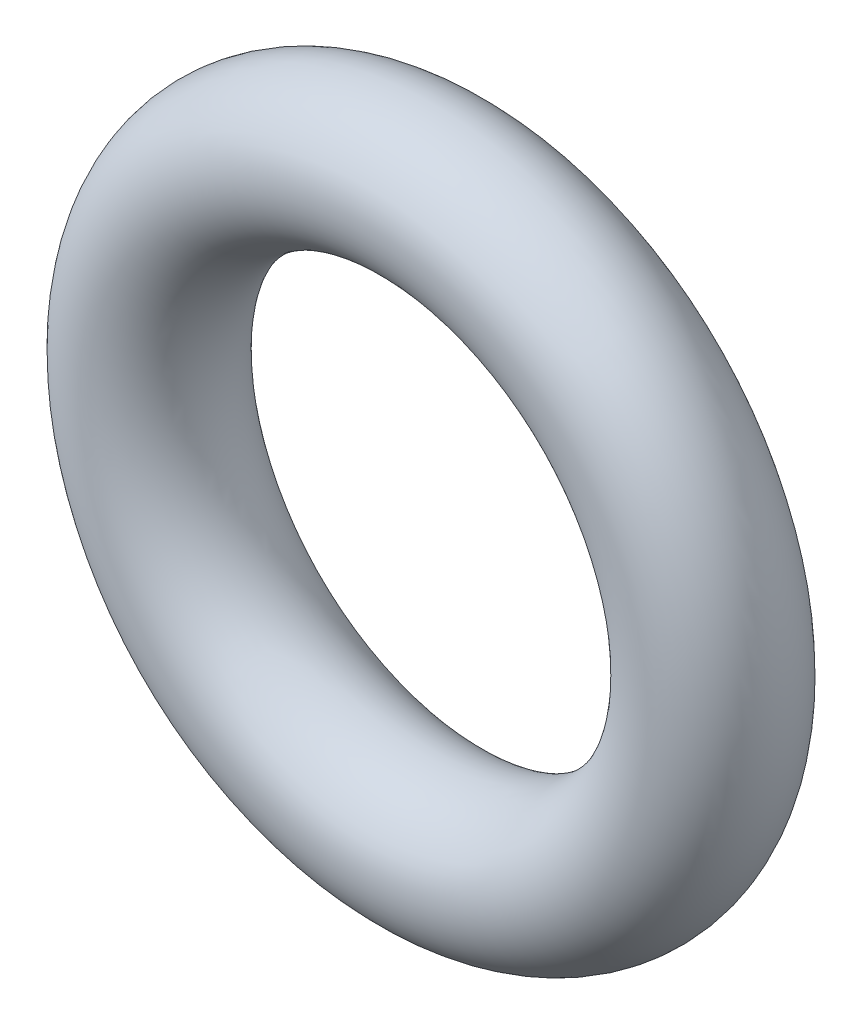
ISO-10303-21;
HEADER;
FILE_DESCRIPTION(('STEP AP214'),'2;1');
FILE_NAME('part.step','',(''),(''),'','','');
FILE_SCHEMA(('AUTOMOTIVE_DESIGN { 1 0 10303 214 1 1 1 1 }'));
ENDSEC;
DATA;
#1=APPLICATION_CONTEXT('core data for automotive mechanical design processes');
#2=APPLICATION_PROTOCOL_DEFINITION('international standard','automotive_design',2000,#1);
#3=PRODUCT_CONTEXT('',#1,'mechanical');
#4=PRODUCT('Part','Part','',(#3));
#5=PRODUCT_RELATED_PRODUCT_CATEGORY('part','',(#4));
#6=PRODUCT_DEFINITION_FORMATION('','',#4);
#7=PRODUCT_DEFINITION_CONTEXT('part definition',#1,'design');
#8=PRODUCT_DEFINITION('design','',#6,#7);
#9=PRODUCT_DEFINITION_SHAPE('','',#8);
#10=(LENGTH_UNIT() NAMED_UNIT(*) SI_UNIT(.MILLI.,.METRE.));
#11=(NAMED_UNIT(*) PLANE_ANGLE_UNIT() SI_UNIT($,.RADIAN.));
#12=(NAMED_UNIT(*) SI_UNIT($,.STERADIAN.) SOLID_ANGLE_UNIT());
#13=UNCERTAINTY_MEASURE_WITH_UNIT(LENGTH_MEASURE(1.E-05),#10,'distance_accuracy_value','');
#14=(GEOMETRIC_REPRESENTATION_CONTEXT(3) GLOBAL_UNCERTAINTY_ASSIGNED_CONTEXT((#13)) GLOBAL_UNIT_ASSIGNED_CONTEXT((#10,
#11,#12)) REPRESENTATION_CONTEXT('',''));
#15=CARTESIAN_POINT('',(0.,0.,0.));
#16=DIRECTION('',(0.,0.,1.));
#17=DIRECTION('',(1.,0.,0.));
#18=AXIS2_PLACEMENT_3D('',#15,#16,#17);
#19=CARTESIAN_POINT('',(0.,0.,0.));
#20=DIRECTION('',(0.,0.,1.));
#21=DIRECTION('',(1.,0.,0.));
#22=AXIS2_PLACEMENT_3D('',#19,#20,#21);
#23=TOROIDAL_SURFACE('',#22,5.1054,1.3081);
#24=CARTESIAN_POINT('',(6.4135,0.,0.));
#25=VERTEX_POINT('',#24);
#26=VERTEX_LOOP('',#25);
#27=FACE_BOUND('',#26,.T.);
#28=ADVANCED_FACE('F27',(#27),#23,.T.);
#29=CLOSED_SHELL('',(#28));
#30=MANIFOLD_SOLID_BREP('B2',#29);
#31=ADVANCED_BREP_SHAPE_REPRESENTATION('',(#18,#30),#14);
#32=SHAPE_DEFINITION_REPRESENTATION(#9,#31);
ENDSEC;
END-ISO-10303-21;
